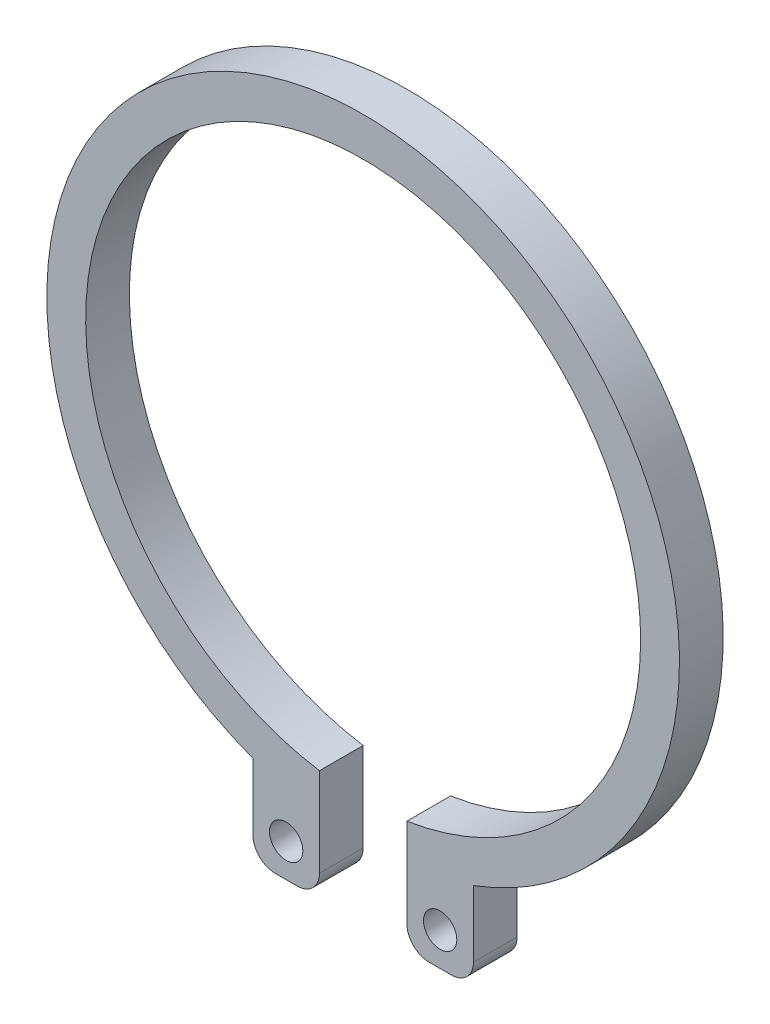
ISO-10303-21;
HEADER;
FILE_DESCRIPTION(('STEP AP214'),'2;1');
FILE_NAME('part.step','',(''),(''),'','','');
FILE_SCHEMA(('AUTOMOTIVE_DESIGN { 1 0 10303 214 1 1 1 1 }'));
ENDSEC;
DATA;
#1=APPLICATION_CONTEXT('core data for automotive mechanical design processes');
#2=APPLICATION_PROTOCOL_DEFINITION('international standard','automotive_design',2000,#1);
#3=PRODUCT_CONTEXT('',#1,'mechanical');
#4=PRODUCT('Part','Part','',(#3));
#5=PRODUCT_RELATED_PRODUCT_CATEGORY('part','',(#4));
#6=PRODUCT_DEFINITION_FORMATION('','',#4);
#7=PRODUCT_DEFINITION_CONTEXT('part definition',#1,'design');
#8=PRODUCT_DEFINITION('design','',#6,#7);
#9=PRODUCT_DEFINITION_SHAPE('','',#8);
#10=(LENGTH_UNIT() NAMED_UNIT(*) SI_UNIT(.MILLI.,.METRE.));
#11=(NAMED_UNIT(*) PLANE_ANGLE_UNIT() SI_UNIT($,.RADIAN.));
#12=(NAMED_UNIT(*) SI_UNIT($,.STERADIAN.) SOLID_ANGLE_UNIT());
#13=UNCERTAINTY_MEASURE_WITH_UNIT(LENGTH_MEASURE(1.E-05),#10,'distance_accuracy_value','');
#14=(GEOMETRIC_REPRESENTATION_CONTEXT(3) GLOBAL_UNCERTAINTY_ASSIGNED_CONTEXT((#13)) GLOBAL_UNIT_ASSIGNED_CONTEXT((#10,
#11,#12)) REPRESENTATION_CONTEXT('',''));
#15=CARTESIAN_POINT('',(0.,0.,0.));
#16=DIRECTION('',(0.,0.,1.));
#17=DIRECTION('',(1.,0.,0.));
#18=AXIS2_PLACEMENT_3D('',#15,#16,#17);
#19=CARTESIAN_POINT('',(0.,0.,0.5));
#20=DIRECTION('',(0.,0.,1.));
#21=DIRECTION('',(1.,0.,0.));
#22=AXIS2_PLACEMENT_3D('',#19,#20,#21);
#23=PLANE('',#22);
#24=DIRECTION('',(-1.,0.,0.));
#25=VECTOR('',#24,1.);
#26=CARTESIAN_POINT('',(-0.5,-4.40538275175456,0.5));
#27=LINE('',#26,#25);
#28=CARTESIAN_POINT('',(-0.754,-4.40538275175456,0.5));
#29=VERTEX_POINT('',#28);
#30=CARTESIAN_POINT('',(-1.008,-4.40538275175456,0.5));
#31=VERTEX_POINT('',#30);
#32=EDGE_CURVE('E238',#29,#31,#27,.T.);
#33=ORIENTED_EDGE('',*,*,#32,.F.);
#34=CARTESIAN_POINT('',(-0.754,-4.15138275175456,0.5));
#35=DIRECTION('',(0.,0.,1.));
#36=DIRECTION('',(1.,0.,0.));
#37=AXIS2_PLACEMENT_3D('',#34,#35,#36);
#38=CIRCLE('',#37,0.254);
#39=CARTESIAN_POINT('',(-0.5,-4.15138275175456,0.5));
#40=VERTEX_POINT('',#39);
#41=EDGE_CURVE('E215',#29,#40,#38,.T.);
#42=ORIENTED_EDGE('',*,*,#41,.T.);
#43=DIRECTION('',(0.,-1.,0.));
#44=VECTOR('',#43,1.);
#45=CARTESIAN_POINT('',(-0.5,-4.13884282998944,0.5));
#46=LINE('',#45,#44);
#47=CARTESIAN_POINT('',(-0.5,-3.13538275175456,0.5));
#48=VERTEX_POINT('',#47);
#49=EDGE_CURVE('E263',#48,#40,#46,.T.);
#50=ORIENTED_EDGE('',*,*,#49,.F.);
#51=CARTESIAN_POINT('',(0.,0.,0.5));
#52=DIRECTION('',(0.,0.,1.));
#53=DIRECTION('',(1.,0.,0.));
#54=AXIS2_PLACEMENT_3D('',#51,#52,#53);
#55=CIRCLE('',#54,3.175);
#56=CARTESIAN_POINT('',(0.5,-3.13538275175456,0.5));
#57=VERTEX_POINT('',#56);
#58=EDGE_CURVE('E166',#57,#48,#55,.T.);
#59=ORIENTED_EDGE('',*,*,#58,.F.);
#60=DIRECTION('',(0.,1.,0.));
#61=VECTOR('',#60,1.);
#62=CARTESIAN_POINT('',(0.5,-2.20818339253144,0.5));
#63=LINE('',#62,#61);
#64=CARTESIAN_POINT('',(0.5,-4.15138275175456,0.5));
#65=VERTEX_POINT('',#64);
#66=EDGE_CURVE('E270',#65,#57,#63,.T.);
#67=ORIENTED_EDGE('',*,*,#66,.F.);
#68=CARTESIAN_POINT('',(0.754,-4.15138275175456,0.5));
#69=DIRECTION('',(0.,0.,1.));
#70=DIRECTION('',(1.,0.,0.));
#71=AXIS2_PLACEMENT_3D('',#68,#69,#70);
#72=CIRCLE('',#71,0.254);
#73=CARTESIAN_POINT('',(0.754,-4.40538275175456,0.5));
#74=VERTEX_POINT('',#73);
#75=EDGE_CURVE('E59',#65,#74,#72,.T.);
#76=ORIENTED_EDGE('',*,*,#75,.T.);
#77=DIRECTION('',(-1.,0.,0.));
#78=VECTOR('',#77,1.);
#79=CARTESIAN_POINT('',(0.5,-4.40538275175456,0.5));
#80=LINE('',#79,#78);
#81=CARTESIAN_POINT('',(1.008,-4.40538275175456,0.5));
#82=VERTEX_POINT('',#81);
#83=EDGE_CURVE('E239',#82,#74,#80,.T.);
#84=ORIENTED_EDGE('',*,*,#83,.F.);
#85=CARTESIAN_POINT('',(1.008,-4.15138275175456,0.5));
#86=DIRECTION('',(0.,0.,1.));
#87=DIRECTION('',(1.,0.,0.));
#88=AXIS2_PLACEMENT_3D('',#85,#86,#87);
#89=CIRCLE('',#88,0.254);
#90=CARTESIAN_POINT('',(1.262,-4.15138275175456,0.5));
#91=VERTEX_POINT('',#90);
#92=EDGE_CURVE('E207',#82,#91,#89,.T.);
#93=ORIENTED_EDGE('',*,*,#92,.T.);
#94=DIRECTION('',(0.,-1.,0.));
#95=VECTOR('',#94,1.);
#96=CARTESIAN_POINT('',(1.262,-3.13538275175456,0.5));
#97=LINE('',#96,#95);
#98=CARTESIAN_POINT('',(1.262,-3.39236440406982,0.5));
#99=VERTEX_POINT('',#98);
#100=EDGE_CURVE('E346',#99,#91,#97,.T.);
#101=ORIENTED_EDGE('',*,*,#100,.F.);
#102=CARTESIAN_POINT('',(0.,0.,0.5));
#103=DIRECTION('',(0.,0.,1.));
#104=DIRECTION('',(1.,0.,0.));
#105=AXIS2_PLACEMENT_3D('',#102,#103,#104);
#106=CIRCLE('',#105,3.6195);
#107=CARTESIAN_POINT('',(-1.262,-3.39236440406982,0.5));
#108=VERTEX_POINT('',#107);
#109=EDGE_CURVE('E155',#99,#108,#106,.T.);
#110=ORIENTED_EDGE('',*,*,#109,.T.);
#111=DIRECTION('',(0.,1.,0.));
#112=VECTOR('',#111,1.);
#113=CARTESIAN_POINT('',(-1.262,-3.13538275175456,0.5));
#114=LINE('',#113,#112);
#115=CARTESIAN_POINT('',(-1.262,-4.15138275175456,0.5));
#116=VERTEX_POINT('',#115);
#117=EDGE_CURVE('E231',#116,#108,#114,.T.);
#118=ORIENTED_EDGE('',*,*,#117,.F.);
#119=CARTESIAN_POINT('',(-1.008,-4.15138275175456,0.5));
#120=DIRECTION('',(0.,0.,1.));
#121=DIRECTION('',(1.,0.,0.));
#122=AXIS2_PLACEMENT_3D('',#119,#120,#121);
#123=CIRCLE('',#122,0.254);
#124=EDGE_CURVE('E210',#116,#31,#123,.T.);
#125=ORIENTED_EDGE('',*,*,#124,.T.);
#126=EDGE_LOOP('',(#33,#42,#50,#59,#67,#76,#84,#93,#101,#110,#118,#125));
#127=FACE_BOUND('',#126,.T.);
#128=CARTESIAN_POINT('',(-0.881,-4.02438275175456,0.5));
#129=DIRECTION('',(0.,0.,1.));
#130=DIRECTION('',(1.,0.,0.));
#131=AXIS2_PLACEMENT_3D('',#128,#129,#130);
#132=CIRCLE('',#131,0.1905);
#133=CARTESIAN_POINT('',(-0.6905,-4.02438275175456,0.5));
#134=VERTEX_POINT('',#133);
#135=EDGE_CURVE('E254',#134,#134,#132,.F.);
#136=ORIENTED_EDGE('',*,*,#135,.T.);
#137=EDGE_LOOP('',(#136));
#138=FACE_BOUND('',#137,.T.);
#139=CARTESIAN_POINT('',(0.881,-4.02438275175456,0.5));
#140=DIRECTION('',(0.,0.,1.));
#141=DIRECTION('',(1.,0.,0.));
#142=AXIS2_PLACEMENT_3D('',#139,#140,#141);
#143=CIRCLE('',#142,0.1905);
#144=CARTESIAN_POINT('',(1.0715,-4.02438275175456,0.5));
#145=VERTEX_POINT('',#144);
#146=EDGE_CURVE('E350',#145,#145,#143,.F.);
#147=ORIENTED_EDGE('',*,*,#146,.T.);
#148=EDGE_LOOP('',(#147));
#149=FACE_BOUND('',#148,.T.);
#150=ADVANCED_FACE('F43',(#127,#138,#149),#23,.T.);
#151=CARTESIAN_POINT('',(0.,0.,0.));
#152=DIRECTION('',(0.,0.,1.));
#153=DIRECTION('',(1.,0.,0.));
#154=AXIS2_PLACEMENT_3D('',#151,#152,#153);
#155=PLANE('',#154);
#156=DIRECTION('',(0.,-1.,0.));
#157=VECTOR('',#156,1.);
#158=CARTESIAN_POINT('',(-0.5,-2.20818339253144,0.));
#159=LINE('',#158,#157);
#160=CARTESIAN_POINT('',(-0.5,-3.13538275175456,0.));
#161=VERTEX_POINT('',#160);
#162=CARTESIAN_POINT('',(-0.5,-4.15138275175456,0.));
#163=VERTEX_POINT('',#162);
#164=EDGE_CURVE('E269',#161,#163,#159,.T.);
#165=ORIENTED_EDGE('',*,*,#164,.T.);
#166=CARTESIAN_POINT('',(-0.754,-4.15138275175456,0.));
#167=DIRECTION('',(0.,0.,1.));
#168=DIRECTION('',(1.,0.,0.));
#169=AXIS2_PLACEMENT_3D('',#166,#167,#168);
#170=CIRCLE('',#169,0.254);
#171=CARTESIAN_POINT('',(-0.754,-4.40538275175456,0.));
#172=VERTEX_POINT('',#171);
#173=EDGE_CURVE('E197',#163,#172,#170,.F.);
#174=ORIENTED_EDGE('',*,*,#173,.T.);
#175=DIRECTION('',(-1.,0.,0.));
#176=VECTOR('',#175,1.);
#177=CARTESIAN_POINT('',(-0.5,-4.40538275175456,0.));
#178=LINE('',#177,#176);
#179=CARTESIAN_POINT('',(-1.008,-4.40538275175456,0.));
#180=VERTEX_POINT('',#179);
#181=EDGE_CURVE('E247',#172,#180,#178,.T.);
#182=ORIENTED_EDGE('',*,*,#181,.T.);
#183=CARTESIAN_POINT('',(-1.008,-4.15138275175456,0.));
#184=DIRECTION('',(0.,0.,1.));
#185=DIRECTION('',(1.,0.,0.));
#186=AXIS2_PLACEMENT_3D('',#183,#184,#185);
#187=CIRCLE('',#186,0.254);
#188=CARTESIAN_POINT('',(-1.262,-4.15138275175456,0.));
#189=VERTEX_POINT('',#188);
#190=EDGE_CURVE('E191',#180,#189,#187,.F.);
#191=ORIENTED_EDGE('',*,*,#190,.T.);
#192=DIRECTION('',(0.,1.,0.));
#193=VECTOR('',#192,1.);
#194=CARTESIAN_POINT('',(-1.262,-3.13538275175456,0.));
#195=LINE('',#194,#193);
#196=CARTESIAN_POINT('',(-1.262,-3.39236440406982,0.));
#197=VERTEX_POINT('',#196);
#198=EDGE_CURVE('E164',#189,#197,#195,.T.);
#199=ORIENTED_EDGE('',*,*,#198,.T.);
#200=CARTESIAN_POINT('',(0.,0.,0.));
#201=DIRECTION('',(0.,0.,1.));
#202=DIRECTION('',(1.,0.,0.));
#203=AXIS2_PLACEMENT_3D('',#200,#201,#202);
#204=CIRCLE('',#203,3.6195);
#205=CARTESIAN_POINT('',(1.262,-3.39236440406982,0.));
#206=VERTEX_POINT('',#205);
#207=EDGE_CURVE('E152',#206,#197,#204,.T.);
#208=ORIENTED_EDGE('',*,*,#207,.F.);
#209=DIRECTION('',(0.,-1.,0.));
#210=VECTOR('',#209,1.);
#211=CARTESIAN_POINT('',(1.262,-3.13538275175456,0.));
#212=LINE('',#211,#210);
#213=CARTESIAN_POINT('',(1.262,-4.15138275175456,0.));
#214=VERTEX_POINT('',#213);
#215=EDGE_CURVE('E135',#206,#214,#212,.T.);
#216=ORIENTED_EDGE('',*,*,#215,.T.);
#217=CARTESIAN_POINT('',(1.008,-4.15138275175456,0.));
#218=DIRECTION('',(0.,0.,1.));
#219=DIRECTION('',(1.,0.,0.));
#220=AXIS2_PLACEMENT_3D('',#217,#218,#219);
#221=CIRCLE('',#220,0.254);
#222=CARTESIAN_POINT('',(1.008,-4.40538275175456,0.));
#223=VERTEX_POINT('',#222);
#224=EDGE_CURVE('E188',#214,#223,#221,.F.);
#225=ORIENTED_EDGE('',*,*,#224,.T.);
#226=DIRECTION('',(-1.,0.,0.));
#227=VECTOR('',#226,1.);
#228=CARTESIAN_POINT('',(0.5,-4.40538275175456,0.));
#229=LINE('',#228,#227);
#230=CARTESIAN_POINT('',(0.754,-4.40538275175456,0.));
#231=VERTEX_POINT('',#230);
#232=EDGE_CURVE('E146',#223,#231,#229,.T.);
#233=ORIENTED_EDGE('',*,*,#232,.T.);
#234=CARTESIAN_POINT('',(0.754,-4.15138275175456,0.));
#235=DIRECTION('',(0.,0.,1.));
#236=DIRECTION('',(1.,0.,0.));
#237=AXIS2_PLACEMENT_3D('',#234,#235,#236);
#238=CIRCLE('',#237,0.254);
#239=CARTESIAN_POINT('',(0.5,-4.15138275175456,0.));
#240=VERTEX_POINT('',#239);
#241=EDGE_CURVE('E194',#231,#240,#238,.F.);
#242=ORIENTED_EDGE('',*,*,#241,.T.);
#243=DIRECTION('',(0.,1.,0.));
#244=VECTOR('',#243,1.);
#245=CARTESIAN_POINT('',(0.5,-2.20818339253144,0.));
#246=LINE('',#245,#244);
#247=CARTESIAN_POINT('',(0.5,-3.13538275175456,0.));
#248=VERTEX_POINT('',#247);
#249=EDGE_CURVE('E266',#240,#248,#246,.T.);
#250=ORIENTED_EDGE('',*,*,#249,.T.);
#251=CARTESIAN_POINT('',(0.,0.,0.));
#252=DIRECTION('',(0.,0.,1.));
#253=DIRECTION('',(1.,0.,0.));
#254=AXIS2_PLACEMENT_3D('',#251,#252,#253);
#255=CIRCLE('',#254,3.175);
#256=EDGE_CURVE('E173',#248,#161,#255,.T.);
#257=ORIENTED_EDGE('',*,*,#256,.T.);
#258=EDGE_LOOP('',(#165,#174,#182,#191,#199,#208,#216,#225,#233,#242,#250,#257));
#259=FACE_BOUND('',#258,.T.);
#260=CARTESIAN_POINT('',(-0.881,-4.02438275175456,0.));
#261=DIRECTION('',(0.,0.,-1.));
#262=DIRECTION('',(-1.,0.,0.));
#263=AXIS2_PLACEMENT_3D('',#260,#261,#262);
#264=CIRCLE('',#263,0.1905);
#265=CARTESIAN_POINT('',(-1.0715,-4.02438275175456,0.));
#266=VERTEX_POINT('',#265);
#267=EDGE_CURVE('E250',#266,#266,#264,.T.);
#268=ORIENTED_EDGE('',*,*,#267,.F.);
#269=EDGE_LOOP('',(#268));
#270=FACE_BOUND('',#269,.T.);
#271=CARTESIAN_POINT('',(0.881,-4.02438275175456,0.));
#272=DIRECTION('',(0.,0.,-1.));
#273=DIRECTION('',(-1.,0.,0.));
#274=AXIS2_PLACEMENT_3D('',#271,#272,#273);
#275=CIRCLE('',#274,0.1905);
#276=CARTESIAN_POINT('',(0.6905,-4.02438275175456,0.));
#277=VERTEX_POINT('',#276);
#278=EDGE_CURVE('E145',#277,#277,#275,.T.);
#279=ORIENTED_EDGE('',*,*,#278,.F.);
#280=EDGE_LOOP('',(#279));
#281=FACE_BOUND('',#280,.T.);
#282=ADVANCED_FACE('F161',(#259,#270,#281),#155,.F.);
#283=CARTESIAN_POINT('',(0.,0.,0.5));
#284=DIRECTION('',(0.,0.,-1.));
#285=DIRECTION('',(-1.,0.,0.));
#286=AXIS2_PLACEMENT_3D('',#283,#284,#285);
#287=CYLINDRICAL_SURFACE('',#286,3.6195);
#288=ORIENTED_EDGE('',*,*,#109,.F.);
#289=DIRECTION('',(0.,0.,-1.));
#290=VECTOR('',#289,1.);
#291=CARTESIAN_POINT('',(1.262,-3.39236440406982,0.5));
#292=LINE('',#291,#290);
#293=EDGE_CURVE('E139',#99,#206,#292,.T.);
#294=ORIENTED_EDGE('',*,*,#293,.T.);
#295=ORIENTED_EDGE('',*,*,#207,.T.);
#296=DIRECTION('',(0.,0.,-1.));
#297=VECTOR('',#296,1.);
#298=CARTESIAN_POINT('',(-1.262,-3.39236440406982,0.5));
#299=LINE('',#298,#297);
#300=EDGE_CURVE('E158',#197,#108,#299,.F.);
#301=ORIENTED_EDGE('',*,*,#300,.T.);
#302=EDGE_LOOP('',(#288,#294,#295,#301));
#303=FACE_BOUND('',#302,.T.);
#304=ADVANCED_FACE('F150',(#303),#287,.T.);
#305=CARTESIAN_POINT('',(0.,0.,0.5));
#306=DIRECTION('',(0.,0.,-1.));
#307=DIRECTION('',(-1.,0.,0.));
#308=AXIS2_PLACEMENT_3D('',#305,#306,#307);
#309=CYLINDRICAL_SURFACE('',#308,3.175);
#310=DIRECTION('',(0.,0.,-1.));
#311=VECTOR('',#310,1.);
#312=CARTESIAN_POINT('',(0.5,-3.13538275175456,0.5));
#313=LINE('',#312,#311);
#314=EDGE_CURVE('E179',#57,#248,#313,.T.);
#315=ORIENTED_EDGE('',*,*,#314,.F.);
#316=ORIENTED_EDGE('',*,*,#58,.T.);
#317=DIRECTION('',(0.,0.,-1.));
#318=VECTOR('',#317,1.);
#319=CARTESIAN_POINT('',(-0.5,-3.13538275175456,0.5));
#320=LINE('',#319,#318);
#321=EDGE_CURVE('E170',#161,#48,#320,.F.);
#322=ORIENTED_EDGE('',*,*,#321,.F.);
#323=ORIENTED_EDGE('',*,*,#256,.F.);
#324=EDGE_LOOP('',(#315,#316,#322,#323));
#325=FACE_BOUND('',#324,.T.);
#326=ADVANCED_FACE('F284',(#325),#309,.F.);
#327=CARTESIAN_POINT('',(-0.5,-4.13884282998944,0.));
#328=DIRECTION('',(-1.,0.,0.));
#329=DIRECTION('',(0.,0.,1.));
#330=AXIS2_PLACEMENT_3D('',#327,#328,#329);
#331=PLANE('',#330);
#332=ORIENTED_EDGE('',*,*,#49,.T.);
#333=DIRECTION('',(0.,0.,-1.));
#334=VECTOR('',#333,1.);
#335=CARTESIAN_POINT('',(-0.5,-4.15138275175456,0.));
#336=LINE('',#335,#334);
#337=EDGE_CURVE('E157',#40,#163,#336,.T.);
#338=ORIENTED_EDGE('',*,*,#337,.T.);
#339=ORIENTED_EDGE('',*,*,#164,.F.);
#340=ORIENTED_EDGE('',*,*,#321,.T.);
#341=EDGE_LOOP('',(#332,#338,#339,#340));
#342=FACE_BOUND('',#341,.T.);
#343=ADVANCED_FACE('F288',(#342),#331,.F.);
#344=CARTESIAN_POINT('',(0.5,-2.20818339253144,0.));
#345=DIRECTION('',(1.,0.,0.));
#346=DIRECTION('',(0.,0.,-1.));
#347=AXIS2_PLACEMENT_3D('',#344,#345,#346);
#348=PLANE('',#347);
#349=ORIENTED_EDGE('',*,*,#249,.F.);
#350=DIRECTION('',(0.,0.,-1.));
#351=VECTOR('',#350,1.);
#352=CARTESIAN_POINT('',(0.5,-4.15138275175456,0.5));
#353=LINE('',#352,#351);
#354=EDGE_CURVE('E224',#240,#65,#353,.F.);
#355=ORIENTED_EDGE('',*,*,#354,.T.);
#356=ORIENTED_EDGE('',*,*,#66,.T.);
#357=ORIENTED_EDGE('',*,*,#314,.T.);
#358=EDGE_LOOP('',(#349,#355,#356,#357));
#359=FACE_BOUND('',#358,.T.);
#360=ADVANCED_FACE('F322',(#359),#348,.F.);
#361=CARTESIAN_POINT('',(-1.262,-3.13538275175456,1.98106178129071));
#362=DIRECTION('',(-1.,0.,0.));
#363=DIRECTION('',(0.,-1.,0.));
#364=AXIS2_PLACEMENT_3D('',#361,#362,#363);
#365=PLANE('',#364);
#366=ORIENTED_EDGE('',*,*,#198,.F.);
#367=DIRECTION('',(0.,0.,-1.));
#368=VECTOR('',#367,1.);
#369=CARTESIAN_POINT('',(-1.262,-4.15138275175456,1.98106178129071));
#370=LINE('',#369,#368);
#371=EDGE_CURVE('E52',#189,#116,#370,.F.);
#372=ORIENTED_EDGE('',*,*,#371,.T.);
#373=ORIENTED_EDGE('',*,*,#117,.T.);
#374=ORIENTED_EDGE('',*,*,#300,.F.);
#375=EDGE_LOOP('',(#366,#372,#373,#374));
#376=FACE_BOUND('',#375,.T.);
#377=ADVANCED_FACE('F230',(#376),#365,.T.);
#378=CARTESIAN_POINT('',(-0.5,-4.40538275175456,1.98106178129071));
#379=DIRECTION('',(0.,-1.,0.));
#380=DIRECTION('',(0.,0.,-1.));
#381=AXIS2_PLACEMENT_3D('',#378,#379,#380);
#382=PLANE('',#381);
#383=ORIENTED_EDGE('',*,*,#181,.F.);
#384=DIRECTION('',(0.,0.,-1.));
#385=VECTOR('',#384,1.);
#386=CARTESIAN_POINT('',(-0.754,-4.40538275175456,0.5));
#387=LINE('',#386,#385);
#388=EDGE_CURVE('E204',#172,#29,#387,.F.);
#389=ORIENTED_EDGE('',*,*,#388,.T.);
#390=ORIENTED_EDGE('',*,*,#32,.T.);
#391=DIRECTION('',(0.,0.,-1.));
#392=VECTOR('',#391,1.);
#393=CARTESIAN_POINT('',(-1.008,-4.40538275175456,1.98106178129071));
#394=LINE('',#393,#392);
#395=EDGE_CURVE('E200',#31,#180,#394,.T.);
#396=ORIENTED_EDGE('',*,*,#395,.T.);
#397=EDGE_LOOP('',(#383,#389,#390,#396));
#398=FACE_BOUND('',#397,.T.);
#399=ADVANCED_FACE('F246',(#398),#382,.T.);
#400=CARTESIAN_POINT('',(-0.881,-4.02438275175456,1.98106178129071));
#401=DIRECTION('',(0.,0.,-1.));
#402=DIRECTION('',(-1.,0.,0.));
#403=AXIS2_PLACEMENT_3D('',#400,#401,#402);
#404=CYLINDRICAL_SURFACE('',#403,0.1905);
#405=ORIENTED_EDGE('',*,*,#267,.T.);
#406=EDGE_LOOP('',(#405));
#407=FACE_BOUND('',#406,.T.);
#408=ORIENTED_EDGE('',*,*,#135,.F.);
#409=EDGE_LOOP('',(#408));
#410=FACE_BOUND('',#409,.T.);
#411=ADVANCED_FACE('F329',(#407,#410),#404,.F.);
#412=CARTESIAN_POINT('',(1.262,-3.13538275175456,1.98106178129071));
#413=DIRECTION('',(1.,0.,0.));
#414=DIRECTION('',(0.,1.,0.));
#415=AXIS2_PLACEMENT_3D('',#412,#413,#414);
#416=PLANE('',#415);
#417=ORIENTED_EDGE('',*,*,#100,.T.);
#418=DIRECTION('',(0.,0.,-1.));
#419=VECTOR('',#418,1.);
#420=CARTESIAN_POINT('',(1.262,-4.15138275175456,1.98106178129071));
#421=LINE('',#420,#419);
#422=EDGE_CURVE('E11',#91,#214,#421,.T.);
#423=ORIENTED_EDGE('',*,*,#422,.T.);
#424=ORIENTED_EDGE('',*,*,#215,.F.);
#425=ORIENTED_EDGE('',*,*,#293,.F.);
#426=EDGE_LOOP('',(#417,#423,#424,#425));
#427=FACE_BOUND('',#426,.T.);
#428=ADVANCED_FACE('F138',(#427),#416,.T.);
#429=CARTESIAN_POINT('',(0.5,-4.40538275175456,1.98106178129071));
#430=DIRECTION('',(0.,-1.,0.));
#431=DIRECTION('',(0.,0.,-1.));
#432=AXIS2_PLACEMENT_3D('',#429,#430,#431);
#433=PLANE('',#432);
#434=ORIENTED_EDGE('',*,*,#83,.T.);
#435=DIRECTION('',(0.,0.,-1.));
#436=VECTOR('',#435,1.);
#437=CARTESIAN_POINT('',(0.754,-4.40538275175456,0.));
#438=LINE('',#437,#436);
#439=EDGE_CURVE('E220',#74,#231,#438,.T.);
#440=ORIENTED_EDGE('',*,*,#439,.T.);
#441=ORIENTED_EDGE('',*,*,#232,.F.);
#442=DIRECTION('',(0.,0.,-1.));
#443=VECTOR('',#442,1.);
#444=CARTESIAN_POINT('',(1.008,-4.40538275175456,1.98106178129071));
#445=LINE('',#444,#443);
#446=EDGE_CURVE('E66',#223,#82,#445,.F.);
#447=ORIENTED_EDGE('',*,*,#446,.T.);
#448=EDGE_LOOP('',(#434,#440,#441,#447));
#449=FACE_BOUND('',#448,.T.);
#450=ADVANCED_FACE('F303',(#449),#433,.T.);
#451=CARTESIAN_POINT('',(0.881,-4.02438275175456,1.98106178129071));
#452=DIRECTION('',(0.,0.,-1.));
#453=DIRECTION('',(-1.,0.,0.));
#454=AXIS2_PLACEMENT_3D('',#451,#452,#453);
#455=CYLINDRICAL_SURFACE('',#454,0.1905);
#456=ORIENTED_EDGE('',*,*,#278,.T.);
#457=EDGE_LOOP('',(#456));
#458=FACE_BOUND('',#457,.T.);
#459=ORIENTED_EDGE('',*,*,#146,.F.);
#460=EDGE_LOOP('',(#459));
#461=FACE_BOUND('',#460,.T.);
#462=ADVANCED_FACE('F295',(#458,#461),#455,.F.);
#463=CARTESIAN_POINT('',(-0.754,-4.15138275175456,0.));
#464=DIRECTION('',(0.,0.,1.));
#465=DIRECTION('',(1.,0.,0.));
#466=AXIS2_PLACEMENT_3D('',#463,#464,#465);
#467=CYLINDRICAL_SURFACE('',#466,0.254);
#468=ORIENTED_EDGE('',*,*,#41,.F.);
#469=ORIENTED_EDGE('',*,*,#388,.F.);
#470=ORIENTED_EDGE('',*,*,#173,.F.);
#471=ORIENTED_EDGE('',*,*,#337,.F.);
#472=EDGE_LOOP('',(#468,#469,#470,#471));
#473=FACE_BOUND('',#472,.T.);
#474=ADVANCED_FACE('F292',(#473),#467,.T.);
#475=CARTESIAN_POINT('',(0.754,-4.15138275175456,1.98106178129071));
#476=DIRECTION('',(0.,0.,1.));
#477=DIRECTION('',(1.,0.,0.));
#478=AXIS2_PLACEMENT_3D('',#475,#476,#477);
#479=CYLINDRICAL_SURFACE('',#478,0.254);
#480=ORIENTED_EDGE('',*,*,#75,.F.);
#481=ORIENTED_EDGE('',*,*,#354,.F.);
#482=ORIENTED_EDGE('',*,*,#241,.F.);
#483=ORIENTED_EDGE('',*,*,#439,.F.);
#484=EDGE_LOOP('',(#480,#481,#482,#483));
#485=FACE_BOUND('',#484,.T.);
#486=ADVANCED_FACE('F294',(#485),#479,.T.);
#487=CARTESIAN_POINT('',(-1.008,-4.15138275175456,1.98106178129071));
#488=DIRECTION('',(0.,0.,-1.));
#489=DIRECTION('',(-1.,0.,0.));
#490=AXIS2_PLACEMENT_3D('',#487,#488,#489);
#491=CYLINDRICAL_SURFACE('',#490,0.254);
#492=ORIENTED_EDGE('',*,*,#124,.F.);
#493=ORIENTED_EDGE('',*,*,#371,.F.);
#494=ORIENTED_EDGE('',*,*,#190,.F.);
#495=ORIENTED_EDGE('',*,*,#395,.F.);
#496=EDGE_LOOP('',(#492,#493,#494,#495));
#497=FACE_BOUND('',#496,.T.);
#498=ADVANCED_FACE('F242',(#497),#491,.T.);
#499=CARTESIAN_POINT('',(1.008,-4.15138275175456,1.98106178129071));
#500=DIRECTION('',(0.,0.,-1.));
#501=DIRECTION('',(-1.,0.,0.));
#502=AXIS2_PLACEMENT_3D('',#499,#500,#501);
#503=CYLINDRICAL_SURFACE('',#502,0.254);
#504=ORIENTED_EDGE('',*,*,#92,.F.);
#505=ORIENTED_EDGE('',*,*,#446,.F.);
#506=ORIENTED_EDGE('',*,*,#224,.F.);
#507=ORIENTED_EDGE('',*,*,#422,.F.);
#508=EDGE_LOOP('',(#504,#505,#506,#507));
#509=FACE_BOUND('',#508,.T.);
#510=ADVANCED_FACE('F45',(#509),#503,.T.);
#511=CLOSED_SHELL('',(#150,#282,#304,#326,#343,#360,#377,#399,#411,#428,#450,#462,#474,#486,
#498,#510));
#512=MANIFOLD_SOLID_BREP('B2',#511);
#513=ADVANCED_BREP_SHAPE_REPRESENTATION('',(#18,#512),#14);
#514=SHAPE_DEFINITION_REPRESENTATION(#9,#513);
ENDSEC;
END-ISO-10303-21;
